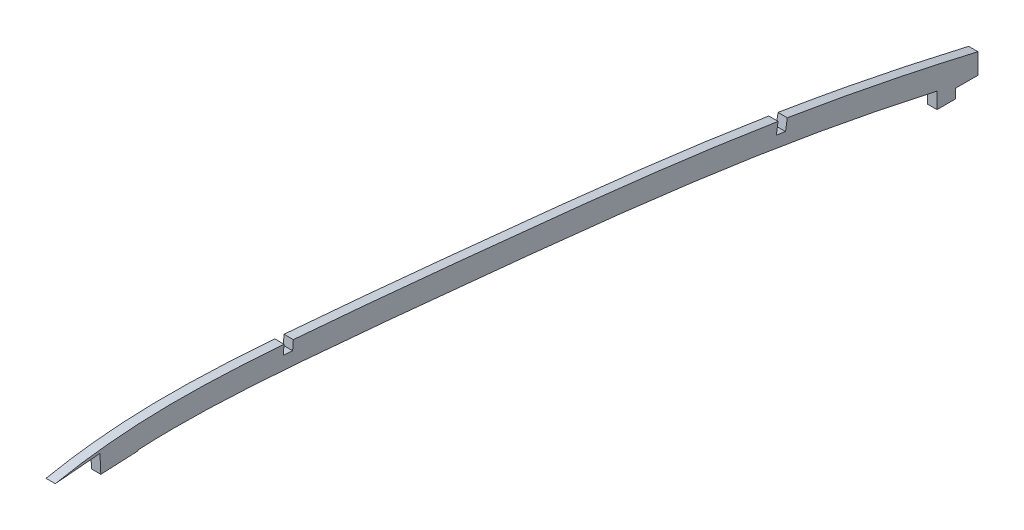
ISO-10303-21;
HEADER;
FILE_DESCRIPTION(('STEP AP214'),'2;1');
FILE_NAME('part.step','',(''),(''),'','','');
FILE_SCHEMA(('AUTOMOTIVE_DESIGN { 1 0 10303 214 1 1 1 1 }'));
ENDSEC;
DATA;
#1=APPLICATION_CONTEXT('core data for automotive mechanical design processes');
#2=APPLICATION_PROTOCOL_DEFINITION('international standard','automotive_design',2000,#1);
#3=PRODUCT_CONTEXT('',#1,'mechanical');
#4=PRODUCT('Part','Part','',(#3));
#5=PRODUCT_RELATED_PRODUCT_CATEGORY('part','',(#4));
#6=PRODUCT_DEFINITION_FORMATION('','',#4);
#7=PRODUCT_DEFINITION_CONTEXT('part definition',#1,'design');
#8=PRODUCT_DEFINITION('design','',#6,#7);
#9=PRODUCT_DEFINITION_SHAPE('','',#8);
#10=(LENGTH_UNIT() NAMED_UNIT(*) SI_UNIT(.MILLI.,.METRE.));
#11=(NAMED_UNIT(*) PLANE_ANGLE_UNIT() SI_UNIT($,.RADIAN.));
#12=(NAMED_UNIT(*) SI_UNIT($,.STERADIAN.) SOLID_ANGLE_UNIT());
#13=UNCERTAINTY_MEASURE_WITH_UNIT(LENGTH_MEASURE(1.E-05),#10,'distance_accuracy_value','');
#14=(GEOMETRIC_REPRESENTATION_CONTEXT(3) GLOBAL_UNCERTAINTY_ASSIGNED_CONTEXT((#13)) GLOBAL_UNIT_ASSIGNED_CONTEXT((#10,
#11,#12)) REPRESENTATION_CONTEXT('',''));
#15=CARTESIAN_POINT('',(0.,0.,0.));
#16=DIRECTION('',(0.,0.,1.));
#17=DIRECTION('',(1.,0.,0.));
#18=AXIS2_PLACEMENT_3D('',#15,#16,#17);
#19=CARTESIAN_POINT('',(371.221000000001,66.3992196076731,-334.782029636412));
#20=CARTESIAN_POINT('',(371.221000000001,67.7130873695188,-341.240992872507));
#21=CARTESIAN_POINT('',(371.221000000001,68.638657355068,-347.742324720006));
#22=CARTESIAN_POINT('',(371.221000000001,69.857875704508,-360.813939728301));
#23=CARTESIAN_POINT('',(371.221000000001,70.1521210315341,-367.384157752233));
#24=CARTESIAN_POINT('',(371.221000000001,70.2402894982842,-377.278023698949));
#25=CARTESIAN_POINT('',(371.221000000001,70.2110429804662,-380.582377006822));
#26=CARTESIAN_POINT('',(371.221000000001,70.0604734169837,-387.201130434233));
#27=CARTESIAN_POINT('',(371.221000000001,69.939172680445,-390.515432634477));
#28=CARTESIAN_POINT('',(371.221000000001,69.4753379407394,-400.442556531051));
#29=CARTESIAN_POINT('',(371.221000000001,69.0383787429707,-407.050981703645));
#30=CARTESIAN_POINT('',(371.221000000001,68.0465549041684,-420.258917861356));
#31=CARTESIAN_POINT('',(371.221000000001,67.4914805811708,-426.858412993564));
#32=CARTESIAN_POINT('',(371.221000000001,66.3221007450081,-440.052925110754));
#33=CARTESIAN_POINT('',(371.221000000001,65.707163942161,-446.647894367368));
#34=CARTESIAN_POINT('',(371.221000000001,64.4483940825608,-459.835648192444));
#35=CARTESIAN_POINT('',(371.221000000001,63.8043306569503,-466.42722381382));
#36=CARTESIAN_POINT('',(371.221000000001,62.5001926301305,-479.607322044501));
#37=CARTESIAN_POINT('',(371.221000000001,61.8391867078308,-486.195809266957));
#38=CARTESIAN_POINT('',(371.221000000001,60.4919854815423,-499.368381393737));
#39=CARTESIAN_POINT('',(371.221000000001,59.8055221678696,-505.95241945833));
#40=CARTESIAN_POINT('',(371.221000000001,58.385795780912,-519.112316449464));
#41=CARTESIAN_POINT('',(371.221000000001,57.6520620801529,-525.688093125005));
#42=CARTESIAN_POINT('',(371.221000000001,56.1076346026462,-538.826196255592));
#43=CARTESIAN_POINT('',(371.221000000001,55.29670062646,-545.388480731269));
#44=CARTESIAN_POINT('',(371.221000000001,53.5677545038648,-558.494335758797));
#45=CARTESIAN_POINT('',(371.221000000001,51.7308224918907,-571.581318221507));
#46=CARTESIAN_POINT('',(371.221000000001,49.6387238173349,-584.623705511581));
#47=CARTESIAN_POINT('',(371.221000000001,47.4079893906498,-597.641863596959));
#48=CARTESIAN_POINT('',(371.221000000001,46.2238100127396,-604.138916419892));
#49=CARTESIAN_POINT('',(371.221000000001,42.4657509816597,-623.594156247111));
#50=CARTESIAN_POINT('',(371.221000000001,39.6851777861279,-636.516219668044));
#51=CARTESIAN_POINT('',(371.221000000001,36.665469862715,-649.396489798407));
#52=B_SPLINE_CURVE_WITH_KNOTS('',3,(#19,#20,#21,#22,#23,#24,#25,#26,#27,#28,#29,#30,#31,#32,#33,
#34,#35,#36,#37,#38,#39,#40,#41,#42,#43,#44,#45,#46,#47,#48,#49,#50,#51),.UNSPECIFIED.,.F.,.F.,
(4,2,2,2,2,2,2,2,2,2,2,2,2,1,2,2,4),(0.,0.0624999999999997,0.124999999999999,0.156249999999999,
0.187499999999999,0.249999999999999,0.3125,0.375,0.4375,0.5,0.5625,0.625,0.6875,0.75,
0.812500000000001,0.875000000000001,1.),.UNSPECIFIED.);
#53=DIRECTION('',(1.,0.,0.));
#54=VECTOR('',#53,1.);
#55=SURFACE_OF_LINEAR_EXTRUSION('',#52,#54);
#56=CARTESIAN_POINT('',(371.221000000001,50.1646603410814,-581.238436134146));
#57=CARTESIAN_POINT('',(371.221000000001,50.6814473705831,-578.018476319009));
#58=CARTESIAN_POINT('',(371.221000000001,52.1957722178972,-568.26884455856));
#59=CARTESIAN_POINT('',(371.221000000001,53.5677545038648,-558.494335758797));
#60=CARTESIAN_POINT('',(371.221000000001,55.29670062646,-545.388480731269));
#61=CARTESIAN_POINT('',(371.221000000001,56.1076346026462,-538.826196255592));
#62=CARTESIAN_POINT('',(371.221000000001,57.6520620801529,-525.688093125005));
#63=CARTESIAN_POINT('',(371.221000000001,58.385795780912,-519.112316449464));
#64=CARTESIAN_POINT('',(371.221000000001,59.8055221678696,-505.95241945833));
#65=CARTESIAN_POINT('',(371.221000000001,60.4919854815423,-499.368381393737));
#66=CARTESIAN_POINT('',(371.221000000001,61.8391867078308,-486.195809266957));
#67=CARTESIAN_POINT('',(371.221000000001,62.5001926301305,-479.607322044501));
#68=CARTESIAN_POINT('',(371.221000000001,63.8043306569503,-466.42722381382));
#69=CARTESIAN_POINT('',(371.221000000001,64.4483940825608,-459.835648192444));
#70=CARTESIAN_POINT('',(371.221000000001,65.707163942161,-446.647894367368));
#71=CARTESIAN_POINT('',(371.221000000001,66.3221007450081,-440.052925110754));
#72=CARTESIAN_POINT('',(371.221000000001,67.4241314218812,-427.618336562321));
#73=CARTESIAN_POINT('',(371.221000000001,67.9182863508203,-421.77925111835));
#74=CARTESIAN_POINT('',(371.221000000001,68.3687879946836,-415.936865287591));
#75=B_SPLINE_CURVE_WITH_KNOTS('',3,(#56,#57,#58,#59,#60,#61,#62,#63,#64,#65,#66,#67,#68,#69,#70,
#71,#72,#73,#74),.UNSPECIFIED.,.F.,.F.,(4,1,2,2,2,2,2,2,2,4),(0.257199238990495,
0.288060226021066,0.350560226021066,0.413060226021066,0.475560226021066,0.538060226021066,
0.600560226021066,0.663060226021066,0.725560226021067,0.780860987030571),.UNSPECIFIED.);
#76=CARTESIAN_POINT('',(371.221000000001,68.3687401782054,-415.936861600501));
#77=VERTEX_POINT('',#76);
#78=CARTESIAN_POINT('',(371.221000000001,50.1646483873828,-581.238434215641));
#79=VERTEX_POINT('',#78);
#80=EDGE_CURVE('E273',#77,#79,#75,.F.);
#81=ORIENTED_EDGE('',*,*,#80,.F.);
#82=DIRECTION('',(1.,0.,0.));
#83=VECTOR('',#82,1.);
#84=CARTESIAN_POINT('',(371.221000000001,68.3687880152294,-415.93686502114));
#85=LINE('',#84,#83);
#86=CARTESIAN_POINT('',(374.396000000001,68.3687394637891,-415.936861415173));
#87=VERTEX_POINT('',#86);
#88=EDGE_CURVE('E201',#77,#87,#85,.T.);
#89=ORIENTED_EDGE('',*,*,#88,.T.);
#90=CARTESIAN_POINT('',(374.396000000001,68.3687879941045,-415.936865295101));
#91=CARTESIAN_POINT('',(374.396000000001,67.9182863503968,-421.779251123354));
#92=CARTESIAN_POINT('',(374.396000000001,67.4241314216595,-427.618336564822));
#93=CARTESIAN_POINT('',(374.396000000001,66.3221007450081,-440.052925110754));
#94=CARTESIAN_POINT('',(374.396000000001,65.707163942161,-446.647894367368));
#95=CARTESIAN_POINT('',(374.396000000001,64.4483940825608,-459.835648192444));
#96=CARTESIAN_POINT('',(374.396000000001,63.8043306569503,-466.42722381382));
#97=CARTESIAN_POINT('',(374.396000000001,62.5001926301305,-479.607322044501));
#98=CARTESIAN_POINT('',(374.396000000001,61.8391867078308,-486.195809266957));
#99=CARTESIAN_POINT('',(374.396000000001,60.4919854815423,-499.368381393737));
#100=CARTESIAN_POINT('',(374.396000000001,59.8055221678696,-505.95241945833));
#101=CARTESIAN_POINT('',(374.396000000001,58.385795780912,-519.112316449464));
#102=CARTESIAN_POINT('',(374.396000000001,57.6520620801529,-525.688093125005));
#103=CARTESIAN_POINT('',(374.396000000001,56.1076346026462,-538.826196255592));
#104=CARTESIAN_POINT('',(374.396000000001,55.29670062646,-545.388480731269));
#105=CARTESIAN_POINT('',(374.396000000001,53.5677545038648,-558.494335758797));
#106=CARTESIAN_POINT('',(374.396000000001,52.1957722178971,-568.26884455856));
#107=CARTESIAN_POINT('',(374.396000000001,50.6814473705829,-578.01847631901));
#108=CARTESIAN_POINT('',(374.396000000001,50.1646603410811,-581.238436134149));
#109=B_SPLINE_CURVE_WITH_KNOTS('',3,(#90,#91,#92,#93,#94,#95,#96,#97,#98,#99,#100,#101,#102,
#103,#104,#105,#106,#107,#108),.UNSPECIFIED.,.F.,.F.,(4,2,2,2,2,2,2,2,1,4),(0.257199239014191,
0.3125,0.375,0.4375,0.5,0.5625,0.625,0.6875,0.75,0.780860987030577),.UNSPECIFIED.);
#110=CARTESIAN_POINT('',(374.396000000001,50.1646543439586,-581.238435171642));
#111=VERTEX_POINT('',#110);
#112=EDGE_CURVE('E333',#87,#111,#109,.T.);
#113=ORIENTED_EDGE('',*,*,#112,.T.);
#114=DIRECTION('',(1.,0.,0.));
#115=VECTOR('',#114,1.);
#116=CARTESIAN_POINT('',(371.221000000001,50.1646603410811,-581.238436134148));
#117=LINE('',#116,#115);
#118=EDGE_CURVE('E53',#111,#79,#117,.F.);
#119=ORIENTED_EDGE('',*,*,#118,.T.);
#120=EDGE_LOOP('',(#81,#89,#113,#119));
#121=FACE_BOUND('',#120,.T.);
#122=ADVANCED_FACE('F33',(#121),#55,.F.);
#123=CARTESIAN_POINT('',(371.221000000001,36.665469862715,-649.396489798407));
#124=CARTESIAN_POINT('',(371.221000000001,39.6851777861279,-636.516219668044));
#125=CARTESIAN_POINT('',(371.221000000001,42.4657509816597,-623.594156247111));
#126=CARTESIAN_POINT('',(371.221000000001,46.2238100127396,-604.138916419892));
#127=CARTESIAN_POINT('',(371.221000000001,47.4079893906498,-597.641863596959));
#128=CARTESIAN_POINT('',(371.221000000001,48.9092485449679,-588.880789771118));
#129=CARTESIAN_POINT('',(371.221000000001,49.2868431071573,-586.627344864992));
#130=CARTESIAN_POINT('',(371.221000000001,49.656369151102,-584.372489833577));
#131=B_SPLINE_CURVE_WITH_KNOTS('',3,(#123,#124,#125,#126,#127,#128,#129,#130),.UNSPECIFIED.,.F.,
.F.,(4,2,2,4),(0.790876407319079,0.915876407319079,0.978376407319079,1.),.UNSPECIFIED.);
#132=CARTESIAN_POINT('',(371.221000000001,49.6563584910032,-584.372488086591));
#133=VERTEX_POINT('',#132);
#134=CARTESIAN_POINT('',(371.221000000001,36.665469862715,-649.396489798407));
#135=VERTEX_POINT('',#134);
#136=EDGE_CURVE('E281',#133,#135,#131,.F.);
#137=ORIENTED_EDGE('',*,*,#136,.F.);
#138=DIRECTION('',(1.,0.,0.));
#139=VECTOR('',#138,1.);
#140=CARTESIAN_POINT('',(371.221000000001,49.6563691568656,-584.372489798407));
#141=LINE('',#140,#139);
#142=CARTESIAN_POINT('',(374.396000000001,49.6563600705722,-584.372488340103));
#143=VERTEX_POINT('',#142);
#144=EDGE_CURVE('E427',#133,#143,#141,.T.);
#145=ORIENTED_EDGE('',*,*,#144,.T.);
#146=CARTESIAN_POINT('',(374.396000000001,49.6563691519565,-584.372489828362));
#147=CARTESIAN_POINT('',(374.396000000001,49.2868431077394,-586.627344861518));
#148=CARTESIAN_POINT('',(374.396000000001,48.9092485452654,-588.880789769382));
#149=CARTESIAN_POINT('',(374.396000000001,47.4079893906498,-597.641863596959));
#150=CARTESIAN_POINT('',(374.396000000001,46.2238100127396,-604.138916419892));
#151=CARTESIAN_POINT('',(374.396000000001,42.4657509816597,-623.594156247111));
#152=CARTESIAN_POINT('',(374.396000000001,39.6851777861279,-636.516219668044));
#153=CARTESIAN_POINT('',(374.396000000001,36.665469862715,-649.396489798407));
#154=B_SPLINE_CURVE_WITH_KNOTS('',3,(#146,#147,#148,#149,#150,#151,#152,#153),.UNSPECIFIED.,.F.,
.F.,(4,2,2,4),(0.79087640730241,0.812500000000001,0.875000000000001,1.),.UNSPECIFIED.);
#155=CARTESIAN_POINT('',(374.396000000001,36.665469862715,-649.396489798407));
#156=VERTEX_POINT('',#155);
#157=EDGE_CURVE('E206',#143,#156,#154,.T.);
#158=ORIENTED_EDGE('',*,*,#157,.T.);
#159=DIRECTION('',(1.,0.,0.));
#160=VECTOR('',#159,1.);
#161=CARTESIAN_POINT('',(371.221000000001,36.665469862715,-649.396489798407));
#162=LINE('',#161,#160);
#163=EDGE_CURVE('E310',#135,#156,#162,.T.);
#164=ORIENTED_EDGE('',*,*,#163,.F.);
#165=EDGE_LOOP('',(#137,#145,#158,#164));
#166=FACE_BOUND('',#165,.T.);
#167=ADVANCED_FACE('F263',(#166),#55,.F.);
#168=CARTESIAN_POINT('',(374.396000000001,66.3992196076731,-334.782029636412));
#169=CARTESIAN_POINT('',(374.396000000001,67.7130873695188,-341.240992872507));
#170=CARTESIAN_POINT('',(374.396000000001,68.638657355068,-347.742324720006));
#171=CARTESIAN_POINT('',(374.396000000001,69.857875704508,-360.813939728301));
#172=CARTESIAN_POINT('',(374.396000000001,70.1521210315341,-367.384157752233));
#173=CARTESIAN_POINT('',(374.396000000001,70.2402894982842,-377.278023698949));
#174=CARTESIAN_POINT('',(374.396000000001,70.2110429804662,-380.582377006822));
#175=CARTESIAN_POINT('',(374.396000000001,70.0604734169837,-387.201130434233));
#176=CARTESIAN_POINT('',(374.396000000001,69.939172680445,-390.515432634477));
#177=CARTESIAN_POINT('',(374.396000000001,69.4891353601354,-400.147260210891));
#178=CARTESIAN_POINT('',(374.396000000001,69.0771183373071,-406.461231657506));
#179=CARTESIAN_POINT('',(374.396000000001,68.608490806381,-412.770923092372));
#180=B_SPLINE_CURVE_WITH_KNOTS('',3,(#168,#169,#170,#171,#172,#173,#174,#175,#176,#177,#178,
#179),.UNSPECIFIED.,.F.,.F.,(4,2,2,2,2,4),(0.,0.0624999999999997,0.124999999999999,
0.156249999999999,0.187499999999999,0.247211273848963),.UNSPECIFIED.);
#181=CARTESIAN_POINT('',(374.396000000001,66.3992196076731,-334.782029636412));
#182=VERTEX_POINT('',#181);
#183=CARTESIAN_POINT('',(374.396000000001,68.6084860600065,-412.770922739949));
#184=VERTEX_POINT('',#183);
#185=EDGE_CURVE('E317',#182,#184,#180,.T.);
#186=ORIENTED_EDGE('',*,*,#185,.T.);
#187=DIRECTION('',(1.,0.,0.));
#188=VECTOR('',#187,1.);
#189=CARTESIAN_POINT('',(371.221000000001,68.6084908063759,-412.770923092441));
#190=LINE('',#189,#188);
#191=CARTESIAN_POINT('',(371.221000000001,68.608480645888,-412.770922337811));
#192=VERTEX_POINT('',#191);
#193=EDGE_CURVE('E61',#184,#192,#190,.F.);
#194=ORIENTED_EDGE('',*,*,#193,.T.);
#195=CARTESIAN_POINT('',(371.221000000001,68.6084908063682,-412.770923092545));
#196=CARTESIAN_POINT('',(371.221000000001,69.0771183372996,-406.461231657621));
#197=CARTESIAN_POINT('',(371.221000000001,69.4891353601327,-400.147260210949));
#198=CARTESIAN_POINT('',(371.221000000001,69.939172680445,-390.515432634477));
#199=CARTESIAN_POINT('',(371.221000000001,70.0604734169837,-387.201130434233));
#200=CARTESIAN_POINT('',(371.221000000001,70.2110429804662,-380.582377006822));
#201=CARTESIAN_POINT('',(371.221000000001,70.2402894982842,-377.278023698949));
#202=CARTESIAN_POINT('',(371.221000000001,70.1521210315341,-367.384157752233));
#203=CARTESIAN_POINT('',(371.221000000001,69.857875704508,-360.813939728301));
#204=CARTESIAN_POINT('',(371.221000000001,68.638657355068,-347.742324720006));
#205=CARTESIAN_POINT('',(371.221000000001,67.7130873695188,-341.240992872507));
#206=CARTESIAN_POINT('',(371.221000000001,66.3992196076731,-334.782029636412));
#207=B_SPLINE_CURVE_WITH_KNOTS('',3,(#195,#196,#197,#198,#199,#200,#201,#202,#203,#204,#205,
#206),.UNSPECIFIED.,.F.,.F.,(4,2,2,2,2,4),(0.,0.0597112738495071,0.0909612738495071,
0.122211273849507,0.184711273849507,0.247211273849506),.UNSPECIFIED.);
#208=CARTESIAN_POINT('',(371.221000000001,66.3992196076731,-334.782029636412));
#209=VERTEX_POINT('',#208);
#210=EDGE_CURVE('E280',#209,#192,#207,.F.);
#211=ORIENTED_EDGE('',*,*,#210,.F.);
#212=DIRECTION('',(1.,0.,0.));
#213=VECTOR('',#212,1.);
#214=CARTESIAN_POINT('',(371.221000000001,66.3992196076731,-334.782029636412));
#215=LINE('',#214,#213);
#216=EDGE_CURVE('E298',#209,#182,#215,.T.);
#217=ORIENTED_EDGE('',*,*,#216,.T.);
#218=EDGE_LOOP('',(#186,#194,#211,#217));
#219=FACE_BOUND('',#218,.T.);
#220=ADVANCED_FACE('F35',(#219),#55,.F.);
#221=CARTESIAN_POINT('',(371.221000000001,29.7064885418863,-649.396489798407));
#222=DIRECTION('',(0.,0.,1.));
#223=DIRECTION('',(0.,-1.,0.));
#224=AXIS2_PLACEMENT_3D('',#221,#222,#223);
#225=PLANE('',#224);
#226=DIRECTION('',(0.,-1.,0.));
#227=VECTOR('',#226,1.);
#228=CARTESIAN_POINT('',(374.396000000001,29.7064885418863,-649.396489798407));
#229=LINE('',#228,#227);
#230=CARTESIAN_POINT('',(374.396000000001,29.7064885418863,-649.396489798407));
#231=VERTEX_POINT('',#230);
#232=EDGE_CURVE('E474',#156,#231,#229,.T.);
#233=ORIENTED_EDGE('',*,*,#232,.T.);
#234=DIRECTION('',(1.,0.,0.));
#235=VECTOR('',#234,1.);
#236=CARTESIAN_POINT('',(371.221000000001,29.7064885418863,-649.396489798407));
#237=LINE('',#236,#235);
#238=CARTESIAN_POINT('',(371.221000000001,29.7064885418863,-649.396489798407));
#239=VERTEX_POINT('',#238);
#240=EDGE_CURVE('E313',#239,#231,#237,.T.);
#241=ORIENTED_EDGE('',*,*,#240,.F.);
#242=DIRECTION('',(0.,-1.,0.));
#243=VECTOR('',#242,1.);
#244=CARTESIAN_POINT('',(371.221000000001,29.7064885418863,-649.396489798407));
#245=LINE('',#244,#243);
#246=EDGE_CURVE('E218',#135,#239,#245,.T.);
#247=ORIENTED_EDGE('',*,*,#246,.F.);
#248=ORIENTED_EDGE('',*,*,#163,.T.);
#249=EDGE_LOOP('',(#233,#241,#247,#248));
#250=FACE_BOUND('',#249,.T.);
#251=ADVANCED_FACE('F256',(#250),#225,.F.);
#252=CARTESIAN_POINT('',(371.221000000001,29.7064889490564,-641.776489798407));
#253=DIRECTION('',(0.,0.999999999999999,-5.34343949227785E-08));
#254=DIRECTION('',(0.,5.34343949227785E-08,0.999999999999999));
#255=AXIS2_PLACEMENT_3D('',#252,#253,#254);
#256=PLANE('',#255);
#257=DIRECTION('',(0.,5.34343949227785E-08,0.999999999999999));
#258=VECTOR('',#257,1.);
#259=CARTESIAN_POINT('',(374.396000000001,29.7064889490564,-641.776489798407));
#260=LINE('',#259,#258);
#261=CARTESIAN_POINT('',(374.396000000001,29.7064889490564,-641.776489798407));
#262=VERTEX_POINT('',#261);
#263=EDGE_CURVE('E496',#231,#262,#260,.T.);
#264=ORIENTED_EDGE('',*,*,#263,.T.);
#265=DIRECTION('',(1.,0.,0.));
#266=VECTOR('',#265,1.);
#267=CARTESIAN_POINT('',(371.221000000001,29.7064889490564,-641.776489798407));
#268=LINE('',#267,#266);
#269=CARTESIAN_POINT('',(371.221000000001,29.7064889490564,-641.776489798407));
#270=VERTEX_POINT('',#269);
#271=EDGE_CURVE('E408',#270,#262,#268,.T.);
#272=ORIENTED_EDGE('',*,*,#271,.F.);
#273=DIRECTION('',(0.,5.34343949227785E-08,0.999999999999999));
#274=VECTOR('',#273,1.);
#275=CARTESIAN_POINT('',(371.221000000001,29.7064889490564,-641.776489798407));
#276=LINE('',#275,#274);
#277=EDGE_CURVE('E212',#239,#270,#276,.T.);
#278=ORIENTED_EDGE('',*,*,#277,.F.);
#279=ORIENTED_EDGE('',*,*,#240,.T.);
#280=EDGE_LOOP('',(#264,#272,#278,#279));
#281=FACE_BOUND('',#280,.T.);
#282=ADVANCED_FACE('F253',(#281),#256,.F.);
#283=CARTESIAN_POINT('',(371.221000000001,29.7064889490564,-641.776489798407));
#284=DIRECTION('',(0.,0.,1.));
#285=DIRECTION('',(1.,0.,0.));
#286=AXIS2_PLACEMENT_3D('',#283,#284,#285);
#287=PLANE('',#286);
#288=DIRECTION('',(0.,-1.,0.));
#289=VECTOR('',#288,1.);
#290=CARTESIAN_POINT('',(374.396000000001,29.7064889490564,-641.776489798407));
#291=LINE('',#290,#289);
#292=CARTESIAN_POINT('',(374.396000000001,26.5314889490564,-641.776489798407));
#293=VERTEX_POINT('',#292);
#294=EDGE_CURVE('E482',#262,#293,#291,.T.);
#295=ORIENTED_EDGE('',*,*,#294,.T.);
#296=DIRECTION('',(1.,0.,0.));
#297=VECTOR('',#296,1.);
#298=CARTESIAN_POINT('',(371.221000000001,26.5314889490564,-641.776489798407));
#299=LINE('',#298,#297);
#300=CARTESIAN_POINT('',(371.221000000001,26.5314889490564,-641.776489798407));
#301=VERTEX_POINT('',#300);
#302=EDGE_CURVE('E405',#301,#293,#299,.T.);
#303=ORIENTED_EDGE('',*,*,#302,.F.);
#304=DIRECTION('',(0.,-1.,0.));
#305=VECTOR('',#304,1.);
#306=CARTESIAN_POINT('',(371.221000000001,29.7064889490564,-641.776489798407));
#307=LINE('',#306,#305);
#308=EDGE_CURVE('E217',#270,#301,#307,.T.);
#309=ORIENTED_EDGE('',*,*,#308,.F.);
#310=ORIENTED_EDGE('',*,*,#271,.T.);
#311=EDGE_LOOP('',(#295,#303,#309,#310));
#312=FACE_BOUND('',#311,.T.);
#313=ADVANCED_FACE('F249',(#312),#287,.F.);
#314=CARTESIAN_POINT('',(371.221000000001,26.5314889490564,-641.776489798407));
#315=DIRECTION('',(0.,1.,0.));
#316=DIRECTION('',(0.,0.,1.));
#317=AXIS2_PLACEMENT_3D('',#314,#315,#316);
#318=PLANE('',#317);
#319=DIRECTION('',(0.,0.,1.));
#320=VECTOR('',#319,1.);
#321=CARTESIAN_POINT('',(374.396000000001,26.5314889490564,-641.776489798407));
#322=LINE('',#321,#320);
#323=CARTESIAN_POINT('',(374.396000000001,26.5314889490564,-635.426489798407));
#324=VERTEX_POINT('',#323);
#325=EDGE_CURVE('E485',#293,#324,#322,.T.);
#326=ORIENTED_EDGE('',*,*,#325,.T.);
#327=DIRECTION('',(1.,0.,0.));
#328=VECTOR('',#327,1.);
#329=CARTESIAN_POINT('',(371.221000000001,26.5314889490564,-635.426489798407));
#330=LINE('',#329,#328);
#331=CARTESIAN_POINT('',(371.221000000001,26.5314889490564,-635.426489798407));
#332=VERTEX_POINT('',#331);
#333=EDGE_CURVE('E402',#332,#324,#330,.T.);
#334=ORIENTED_EDGE('',*,*,#333,.F.);
#335=DIRECTION('',(0.,0.,1.));
#336=VECTOR('',#335,1.);
#337=CARTESIAN_POINT('',(371.221000000001,26.5314889490564,-641.776489798407));
#338=LINE('',#337,#336);
#339=EDGE_CURVE('E220',#301,#332,#338,.T.);
#340=ORIENTED_EDGE('',*,*,#339,.F.);
#341=ORIENTED_EDGE('',*,*,#302,.T.);
#342=EDGE_LOOP('',(#326,#334,#340,#341));
#343=FACE_BOUND('',#342,.T.);
#344=ADVANCED_FACE('F245',(#343),#318,.F.);
#345=CARTESIAN_POINT('',(371.221000000001,26.5314889490564,-635.426489798407));
#346=DIRECTION('',(0.,4.4359293191835E-13,-1.));
#347=DIRECTION('',(0.,1.,4.4359293191835E-13));
#348=AXIS2_PLACEMENT_3D('',#345,#346,#347);
#349=PLANE('',#348);
#350=DIRECTION('',(0.,1.,4.4359293191835E-13));
#351=VECTOR('',#350,1.);
#352=CARTESIAN_POINT('',(374.396000000001,26.5314889490564,-635.426489798407));
#353=LINE('',#352,#351);
#354=CARTESIAN_POINT('',(374.396000000001,32.0376421774512,-635.426489798405));
#355=VERTEX_POINT('',#354);
#356=EDGE_CURVE('E500',#324,#355,#353,.T.);
#357=ORIENTED_EDGE('',*,*,#356,.T.);
#358=DIRECTION('',(1.,0.,0.));
#359=VECTOR('',#358,1.);
#360=CARTESIAN_POINT('',(371.221000000001,32.0376421774512,-635.426489798405));
#361=LINE('',#360,#359);
#362=CARTESIAN_POINT('',(371.221000000001,32.0376421774512,-635.426489798405));
#363=VERTEX_POINT('',#362);
#364=EDGE_CURVE('E399',#363,#355,#361,.T.);
#365=ORIENTED_EDGE('',*,*,#364,.F.);
#366=DIRECTION('',(0.,1.,4.4359293191835E-13));
#367=VECTOR('',#366,1.);
#368=CARTESIAN_POINT('',(371.221000000001,26.5314889490564,-635.426489798407));
#369=LINE('',#368,#367);
#370=EDGE_CURVE('E222',#332,#363,#369,.T.);
#371=ORIENTED_EDGE('',*,*,#370,.F.);
#372=ORIENTED_EDGE('',*,*,#333,.T.);
#373=EDGE_LOOP('',(#357,#365,#371,#372));
#374=FACE_BOUND('',#373,.T.);
#375=ADVANCED_FACE('F240',(#374),#349,.F.);
#376=CARTESIAN_POINT('',(371.221000000001,29.2465511887877,-647.657163157849));
#377=CARTESIAN_POINT('',(371.221000000001,32.2405915847302,-634.886317517452));
#378=CARTESIAN_POINT('',(371.221000000001,37.7672170314206,-609.213099306468));
#379=CARTESIAN_POINT('',(371.221000000001,44.3897007191742,-570.497357953247));
#380=CARTESIAN_POINT('',(371.221000000001,49.463490269808,-531.419980681302));
#381=CARTESIAN_POINT('',(371.221000000001,53.6268939195985,-492.027742401827));
#382=CARTESIAN_POINT('',(371.221000000001,57.5382629763181,-452.509928359852));
#383=CARTESIAN_POINT('',(371.221000000001,60.5662956779507,-419.617452947087));
#384=CARTESIAN_POINT('',(371.221000000001,62.3036339621135,-393.439667345239));
#385=CARTESIAN_POINT('',(371.221000000001,62.8199774802091,-373.981350077034));
#386=CARTESIAN_POINT('',(371.221000000001,61.961505687984,-354.922859380197));
#387=CARTESIAN_POINT('',(371.221000000001,60.1864395261689,-342.469032662402));
#388=CARTESIAN_POINT('',(371.221000000001,58.93174494889,-336.300996107459));
#389=B_SPLINE_CURVE_WITH_KNOTS('',3,(#376,#377,#378,#379,#380,#381,#382,#383,#384,#385,#386,
#387,#388),.UNSPECIFIED.,.F.,.F.,(4,1,1,1,1,1,1,1,1,1,4),(0.,0.125,0.25,0.375,0.5,0.625,0.75,
0.8125,0.875,0.9375,1.),.UNSPECIFIED.);
#390=DIRECTION('',(1.,0.,0.));
#391=VECTOR('',#390,1.);
#392=SURFACE_OF_LINEAR_EXTRUSION('',#389,#391);
#393=CARTESIAN_POINT('',(374.396000000001,29.2465511887877,-647.657163157849));
#394=CARTESIAN_POINT('',(374.396000000001,32.2405915847302,-634.886317517452));
#395=CARTESIAN_POINT('',(374.396000000001,37.7672170314206,-609.213099306468));
#396=CARTESIAN_POINT('',(374.396000000001,44.3897007191742,-570.497357953247));
#397=CARTESIAN_POINT('',(374.396000000001,49.463490269808,-531.419980681302));
#398=CARTESIAN_POINT('',(374.396000000001,53.6268939195985,-492.027742401827));
#399=CARTESIAN_POINT('',(374.396000000001,57.5382629763181,-452.509928359852));
#400=CARTESIAN_POINT('',(374.396000000001,60.5662956779507,-419.617452947087));
#401=CARTESIAN_POINT('',(374.396000000001,62.3036339621135,-393.439667345239));
#402=CARTESIAN_POINT('',(374.396000000001,62.8199774802091,-373.981350077034));
#403=CARTESIAN_POINT('',(374.396000000001,61.961505687984,-354.922859380197));
#404=CARTESIAN_POINT('',(374.396000000001,60.1864395261689,-342.469032662402));
#405=CARTESIAN_POINT('',(374.396000000001,58.93174494889,-336.300996107459));
#406=B_SPLINE_CURVE_WITH_KNOTS('',3,(#393,#394,#395,#396,#397,#398,#399,#400,#401,#402,#403,
#404,#405),.UNSPECIFIED.,.F.,.F.,(4,1,1,1,1,1,1,1,1,1,4),(0.,0.125,0.25,0.375,0.5,0.625,0.75,
0.8125,0.875,0.9375,1.),.UNSPECIFIED.);
#407=CARTESIAN_POINT('',(374.396000000001,62.2480642985556,-362.974756295208));
#408=VERTEX_POINT('',#407);
#409=EDGE_CURVE('E492',#355,#408,#406,.T.);
#410=ORIENTED_EDGE('',*,*,#409,.T.);
#411=DIRECTION('',(1.,0.,0.));
#412=VECTOR('',#411,1.);
#413=CARTESIAN_POINT('',(371.221000000001,62.2480642985556,-362.974756295208));
#414=LINE('',#413,#412);
#415=CARTESIAN_POINT('',(371.221000000001,62.2480642985556,-362.974756295208));
#416=VERTEX_POINT('',#415);
#417=EDGE_CURVE('E396',#416,#408,#414,.T.);
#418=ORIENTED_EDGE('',*,*,#417,.F.);
#419=EDGE_CURVE('E224',#363,#416,#389,.T.);
#420=ORIENTED_EDGE('',*,*,#419,.F.);
#421=ORIENTED_EDGE('',*,*,#364,.T.);
#422=EDGE_LOOP('',(#410,#418,#420,#421));
#423=FACE_BOUND('',#422,.T.);
#424=ADVANCED_FACE('F235',(#423),#392,.F.);
#425=CARTESIAN_POINT('',(371.221000000001,61.9862212154004,-362.986941179701));
#426=DIRECTION('',(0.,-0.0464847590306807,0.998918999307681));
#427=DIRECTION('',(0.,-0.998918999307681,-0.0464847590306807));
#428=AXIS2_PLACEMENT_3D('',#425,#426,#427);
#429=PLANE('',#428);
#430=DIRECTION('',(0.,-0.998918999307681,-0.0464847590306807));
#431=VECTOR('',#430,1.);
#432=CARTESIAN_POINT('',(374.396000000001,61.9862212154004,-362.986941179701));
#433=LINE('',#432,#431);
#434=CARTESIAN_POINT('',(374.396000000001,61.9862212154004,-362.986941179701));
#435=VERTEX_POINT('',#434);
#436=EDGE_CURVE('E385',#408,#435,#433,.T.);
#437=ORIENTED_EDGE('',*,*,#436,.T.);
#438=DIRECTION('',(1.,0.,0.));
#439=VECTOR('',#438,1.);
#440=CARTESIAN_POINT('',(371.221000000001,61.9862212154004,-362.986941179701));
#441=LINE('',#440,#439);
#442=CARTESIAN_POINT('',(371.221000000001,61.9862212154004,-362.986941179701));
#443=VERTEX_POINT('',#442);
#444=EDGE_CURVE('E381',#443,#435,#441,.T.);
#445=ORIENTED_EDGE('',*,*,#444,.F.);
#446=DIRECTION('',(0.,-0.998918999307681,-0.0464847590306807));
#447=VECTOR('',#446,1.);
#448=CARTESIAN_POINT('',(371.221000000001,61.9862212154004,-362.986941179701));
#449=LINE('',#448,#447);
#450=EDGE_CURVE('E229',#416,#443,#449,.T.);
#451=ORIENTED_EDGE('',*,*,#450,.F.);
#452=ORIENTED_EDGE('',*,*,#417,.T.);
#453=EDGE_LOOP('',(#437,#445,#451,#452));
#454=FACE_BOUND('',#453,.T.);
#455=ADVANCED_FACE('F239',(#454),#429,.F.);
#456=CARTESIAN_POINT('',(371.221000000001,61.3958645640779,-350.300669898342));
#457=DIRECTION('',(0.,0.998918998532221,0.0464847756946805));
#458=DIRECTION('',(0.,-0.0464847756946805,0.998918998532221));
#459=AXIS2_PLACEMENT_3D('',#456,#457,#458);
#460=PLANE('',#459);
#461=DIRECTION('',(0.,-0.0464847756946804,0.998918998532221));
#462=VECTOR('',#461,1.);
#463=CARTESIAN_POINT('',(374.396000000001,61.3958645640779,-350.300669898342));
#464=LINE('',#463,#462);
#465=CARTESIAN_POINT('',(374.396000000001,61.3958645640779,-350.300669898342));
#466=VERTEX_POINT('',#465);
#467=EDGE_CURVE('E375',#435,#466,#464,.T.);
#468=ORIENTED_EDGE('',*,*,#467,.T.);
#469=DIRECTION('',(1.,0.,0.));
#470=VECTOR('',#469,1.);
#471=CARTESIAN_POINT('',(371.221000000001,61.3958645640779,-350.300669898342));
#472=LINE('',#471,#470);
#473=CARTESIAN_POINT('',(371.221000000001,61.3958645640779,-350.300669898342));
#474=VERTEX_POINT('',#473);
#475=EDGE_CURVE('E378',#474,#466,#472,.T.);
#476=ORIENTED_EDGE('',*,*,#475,.F.);
#477=DIRECTION('',(0.,-0.0464847756946804,0.998918998532221));
#478=VECTOR('',#477,1.);
#479=CARTESIAN_POINT('',(371.221000000001,61.3958645640779,-350.300669898342));
#480=LINE('',#479,#478);
#481=EDGE_CURVE('E493',#443,#474,#480,.T.);
#482=ORIENTED_EDGE('',*,*,#481,.F.);
#483=ORIENTED_EDGE('',*,*,#444,.T.);
#484=EDGE_LOOP('',(#468,#476,#482,#483));
#485=FACE_BOUND('',#484,.T.);
#486=ADVANCED_FACE('F364',(#485),#460,.F.);
#487=CARTESIAN_POINT('',(371.221000000001,67.7376355024269,-350.005555185235));
#488=DIRECTION('',(0.,0.0464847590307341,-0.998918999307679));
#489=DIRECTION('',(0.,0.998918999307679,0.0464847590307341));
#490=AXIS2_PLACEMENT_3D('',#487,#488,#489);
#491=PLANE('',#490);
#492=DIRECTION('',(0.,0.998918999307679,0.0464847590307341));
#493=VECTOR('',#492,1.);
#494=CARTESIAN_POINT('',(374.396000000001,67.7376355024269,-350.005555185235));
#495=LINE('',#494,#493);
#496=CARTESIAN_POINT('',(374.396000000001,67.7376355024269,-350.005555185235));
#497=VERTEX_POINT('',#496);
#498=EDGE_CURVE('E384',#466,#497,#495,.T.);
#499=ORIENTED_EDGE('',*,*,#498,.T.);
#500=DIRECTION('',(1.,0.,0.));
#501=VECTOR('',#500,1.);
#502=CARTESIAN_POINT('',(371.221000000001,67.7376355024269,-350.005555185235));
#503=LINE('',#502,#501);
#504=CARTESIAN_POINT('',(371.221000000001,67.7376355024269,-350.005555185235));
#505=VERTEX_POINT('',#504);
#506=EDGE_CURVE('E304',#505,#497,#503,.T.);
#507=ORIENTED_EDGE('',*,*,#506,.F.);
#508=DIRECTION('',(0.,0.998918999307679,0.0464847590307341));
#509=VECTOR('',#508,1.);
#510=CARTESIAN_POINT('',(371.221000000001,67.7376355024269,-350.005555185235));
#511=LINE('',#510,#509);
#512=EDGE_CURVE('E299',#474,#505,#511,.T.);
#513=ORIENTED_EDGE('',*,*,#512,.F.);
#514=ORIENTED_EDGE('',*,*,#475,.T.);
#515=EDGE_LOOP('',(#499,#507,#513,#514));
#516=FACE_BOUND('',#515,.T.);
#517=ADVANCED_FACE('F361',(#516),#491,.F.);
#518=CARTESIAN_POINT('',(371.221000000001,66.3992196076731,-334.782029636412));
#519=DIRECTION('',(0.,0.996157508555007,0.0875797816249874));
#520=DIRECTION('',(0.,-0.0875797816249874,0.996157508555007));
#521=AXIS2_PLACEMENT_3D('',#518,#519,#520);
#522=PLANE('',#521);
#523=DIRECTION('',(0.,-0.0875797816249874,0.996157508555007));
#524=VECTOR('',#523,1.);
#525=CARTESIAN_POINT('',(374.396000000001,66.3992196076731,-334.782029636412));
#526=LINE('',#525,#524);
#527=EDGE_CURVE('E341',#497,#182,#526,.T.);
#528=ORIENTED_EDGE('',*,*,#527,.T.);
#529=ORIENTED_EDGE('',*,*,#216,.F.);
#530=DIRECTION('',(0.,-0.0875797816249874,0.996157508555007));
#531=VECTOR('',#530,1.);
#532=CARTESIAN_POINT('',(371.221000000001,66.3992196076731,-334.782029636412));
#533=LINE('',#532,#531);
#534=EDGE_CURVE('E289',#505,#209,#533,.T.);
#535=ORIENTED_EDGE('',*,*,#534,.F.);
#536=ORIENTED_EDGE('',*,*,#506,.T.);
#537=EDGE_LOOP('',(#528,#529,#535,#536));
#538=FACE_BOUND('',#537,.T.);
#539=ADVANCED_FACE('F358',(#538),#522,.F.);
#540=CARTESIAN_POINT('',(371.221000000001,61.1655860946865,-492.782095330347));
#541=DIRECTION('',(-1.,0.,0.));
#542=DIRECTION('',(0.,0.,1.));
#543=AXIS2_PLACEMENT_3D('',#540,#541,#542);
#544=PLANE('',#543);
#545=DIRECTION('',(0.,-0.997253262558018,0.0740670663479331));
#546=VECTOR('',#545,1.);
#547=CARTESIAN_POINT('',(371.221000000001,66.8811695227003,-415.826378004729));
#548=LINE('',#547,#546);
#549=CARTESIAN_POINT('',(371.221000000001,65.2070487620996,-415.702039265408));
#550=VERTEX_POINT('',#549);
#551=EDGE_CURVE('E199',#77,#550,#548,.T.);
#552=ORIENTED_EDGE('',*,*,#551,.F.);
#553=ORIENTED_EDGE('',*,*,#80,.T.);
#554=DIRECTION('',(0.,0.987364289805928,-0.158466902588635));
#555=VECTOR('',#554,1.);
#556=CARTESIAN_POINT('',(371.221000000001,47.0490509881663,-580.738396818437));
#557=LINE('',#556,#555);
#558=CARTESIAN_POINT('',(371.221000000001,46.40280239692,-580.634677235286));
#559=VERTEX_POINT('',#558);
#560=EDGE_CURVE('E451',#559,#79,#557,.T.);
#561=ORIENTED_EDGE('',*,*,#560,.F.);
#562=DIRECTION('',(0.,0.158466902588543,0.987364289805943));
#563=VECTOR('',#562,1.);
#564=CARTESIAN_POINT('',(371.221000000001,60.519337503432,-492.678375747194));
#565=LINE('',#564,#563);
#566=CARTESIAN_POINT('',(371.221000000001,45.8996699812014,-583.76955885542));
#567=VERTEX_POINT('',#566);
#568=EDGE_CURVE('E441',#567,#559,#565,.T.);
#569=ORIENTED_EDGE('',*,*,#568,.F.);
#570=DIRECTION('',(0.,-0.987364289805934,0.158466902588595));
#571=VECTOR('',#570,1.);
#572=CARTESIAN_POINT('',(371.221000000001,46.5459185724511,-583.873278438571));
#573=LINE('',#572,#571);
#574=EDGE_CURVE('E437',#133,#567,#573,.T.);
#575=ORIENTED_EDGE('',*,*,#574,.F.);
#576=ORIENTED_EDGE('',*,*,#136,.T.);
#577=ORIENTED_EDGE('',*,*,#246,.T.);
#578=ORIENTED_EDGE('',*,*,#277,.T.);
#579=ORIENTED_EDGE('',*,*,#308,.T.);
#580=ORIENTED_EDGE('',*,*,#339,.T.);
#581=ORIENTED_EDGE('',*,*,#370,.T.);
#582=ORIENTED_EDGE('',*,*,#419,.T.);
#583=ORIENTED_EDGE('',*,*,#450,.T.);
#584=ORIENTED_EDGE('',*,*,#481,.T.);
#585=ORIENTED_EDGE('',*,*,#512,.T.);
#586=ORIENTED_EDGE('',*,*,#534,.T.);
#587=ORIENTED_EDGE('',*,*,#210,.T.);
#588=DIRECTION('',(0.,0.997253262558022,-0.0740670663478767));
#589=VECTOR('',#588,1.);
#590=CARTESIAN_POINT('',(371.221000000001,67.1163324583505,-412.660098896107));
#591=LINE('',#590,#589);
#592=CARTESIAN_POINT('',(371.221000000001,65.4422116977542,-412.535760156787));
#593=VERTEX_POINT('',#592);
#594=EDGE_CURVE('E423',#593,#192,#591,.T.);
#595=ORIENTED_EDGE('',*,*,#594,.F.);
#596=DIRECTION('',(0.,0.0740670663478944,0.997253262558021));
#597=VECTOR('',#596,1.);
#598=CARTESIAN_POINT('',(371.221000000001,59.4914653340888,-492.657756591026));
#599=LINE('',#598,#597);
#600=EDGE_CURVE('E177',#550,#593,#599,.T.);
#601=ORIENTED_EDGE('',*,*,#600,.F.);
#602=EDGE_LOOP('',(#552,#553,#561,#569,#575,#576,#577,#578,#579,#580,#581,#582,#583,#584,#585,
#586,#587,#595,#601));
#603=FACE_BOUND('',#602,.T.);
#604=ADVANCED_FACE('F355',(#603),#544,.T.);
#605=CARTESIAN_POINT('',(374.396000000001,61.1655860946865,-492.782095330347));
#606=DIRECTION('',(-1.,0.,0.));
#607=DIRECTION('',(0.,0.,1.));
#608=AXIS2_PLACEMENT_3D('',#605,#606,#607);
#609=PLANE('',#608);
#610=ORIENTED_EDGE('',*,*,#112,.F.);
#611=DIRECTION('',(0.,0.997253262558018,-0.0740670663479331));
#612=VECTOR('',#611,1.);
#613=CARTESIAN_POINT('',(374.396000000001,69.5608104532614,-416.025397802451));
#614=LINE('',#613,#612);
#615=CARTESIAN_POINT('',(374.396000000001,65.2070487620996,-415.702039265408));
#616=VERTEX_POINT('',#615);
#617=EDGE_CURVE('E180',#616,#87,#614,.T.);
#618=ORIENTED_EDGE('',*,*,#617,.F.);
#619=DIRECTION('',(0.,-0.0740670663478944,-0.997253262558021));
#620=VECTOR('',#619,1.);
#621=CARTESIAN_POINT('',(374.396000000001,65.4422116977542,-412.535760156787));
#622=LINE('',#621,#620);
#623=CARTESIAN_POINT('',(374.396000000001,65.4422116977542,-412.535760156787));
#624=VERTEX_POINT('',#623);
#625=EDGE_CURVE('E174',#624,#616,#622,.T.);
#626=ORIENTED_EDGE('',*,*,#625,.F.);
#627=DIRECTION('',(0.,0.997253262558022,-0.0740670663478767));
#628=VECTOR('',#627,1.);
#629=CARTESIAN_POINT('',(374.396000000001,67.1163324583505,-412.660098896107));
#630=LINE('',#629,#628);
#631=EDGE_CURVE('E11',#624,#184,#630,.T.);
#632=ORIENTED_EDGE('',*,*,#631,.T.);
#633=ORIENTED_EDGE('',*,*,#185,.F.);
#634=ORIENTED_EDGE('',*,*,#527,.F.);
#635=ORIENTED_EDGE('',*,*,#498,.F.);
#636=ORIENTED_EDGE('',*,*,#467,.F.);
#637=ORIENTED_EDGE('',*,*,#436,.F.);
#638=ORIENTED_EDGE('',*,*,#409,.F.);
#639=ORIENTED_EDGE('',*,*,#356,.F.);
#640=ORIENTED_EDGE('',*,*,#325,.F.);
#641=ORIENTED_EDGE('',*,*,#294,.F.);
#642=ORIENTED_EDGE('',*,*,#263,.F.);
#643=ORIENTED_EDGE('',*,*,#232,.F.);
#644=ORIENTED_EDGE('',*,*,#157,.F.);
#645=DIRECTION('',(0.,0.987364289805934,-0.158466902588595));
#646=VECTOR('',#645,1.);
#647=CARTESIAN_POINT('',(374.396000000001,49.6563691568656,-584.372489798407));
#648=LINE('',#647,#646);
#649=CARTESIAN_POINT('',(374.396000000001,45.8996699812014,-583.76955885542));
#650=VERTEX_POINT('',#649);
#651=EDGE_CURVE('E442',#650,#143,#648,.T.);
#652=ORIENTED_EDGE('',*,*,#651,.F.);
#653=DIRECTION('',(0.,-0.158466902588543,-0.987364289805943));
#654=VECTOR('',#653,1.);
#655=CARTESIAN_POINT('',(374.396000000001,46.40280239692,-580.634677235286));
#656=LINE('',#655,#654);
#657=CARTESIAN_POINT('',(374.396000000001,46.40280239692,-580.634677235286));
#658=VERTEX_POINT('',#657);
#659=EDGE_CURVE('E445',#658,#650,#656,.T.);
#660=ORIENTED_EDGE('',*,*,#659,.F.);
#661=DIRECTION('',(0.,0.987364289805928,-0.158466902588635));
#662=VECTOR('',#661,1.);
#663=CARTESIAN_POINT('',(374.396000000001,47.0490509881663,-580.738396818437));
#664=LINE('',#663,#662);
#665=EDGE_CURVE('E45',#658,#111,#664,.T.);
#666=ORIENTED_EDGE('',*,*,#665,.T.);
#667=EDGE_LOOP('',(#610,#618,#626,#632,#633,#634,#635,#636,#637,#638,#639,#640,#641,#642,#643,
#644,#652,#660,#666));
#668=FACE_BOUND('',#667,.T.);
#669=ADVANCED_FACE('F187',(#668),#609,.F.);
#670=CARTESIAN_POINT('',(371.211000000001,49.6563691568656,-584.372489798407));
#671=DIRECTION('',(0.,-0.158466902588595,-0.987364289805934));
#672=DIRECTION('',(0.,0.987364289805934,-0.158466902588595));
#673=AXIS2_PLACEMENT_3D('',#670,#671,#672);
#674=PLANE('',#673);
#675=ORIENTED_EDGE('',*,*,#574,.T.);
#676=DIRECTION('',(1.,0.,0.));
#677=VECTOR('',#676,1.);
#678=CARTESIAN_POINT('',(371.211000000001,45.8996699812014,-583.76955885542));
#679=LINE('',#678,#677);
#680=EDGE_CURVE('E188',#567,#650,#679,.T.);
#681=ORIENTED_EDGE('',*,*,#680,.T.);
#682=ORIENTED_EDGE('',*,*,#651,.T.);
#683=ORIENTED_EDGE('',*,*,#144,.F.);
#684=EDGE_LOOP('',(#675,#681,#682,#683));
#685=FACE_BOUND('',#684,.T.);
#686=ADVANCED_FACE('F354',(#685),#674,.F.);
#687=CARTESIAN_POINT('',(371.211000000001,50.1646603410811,-581.238436134148));
#688=DIRECTION('',(0.,0.158466902588635,0.987364289805928));
#689=DIRECTION('',(0.,-0.987364289805928,0.158466902588635));
#690=AXIS2_PLACEMENT_3D('',#687,#688,#689);
#691=PLANE('',#690);
#692=ORIENTED_EDGE('',*,*,#665,.F.);
#693=DIRECTION('',(1.,0.,0.));
#694=VECTOR('',#693,1.);
#695=CARTESIAN_POINT('',(371.211000000001,46.40280239692,-580.634677235286));
#696=LINE('',#695,#694);
#697=EDGE_CURVE('E191',#559,#658,#696,.T.);
#698=ORIENTED_EDGE('',*,*,#697,.F.);
#699=ORIENTED_EDGE('',*,*,#560,.T.);
#700=ORIENTED_EDGE('',*,*,#118,.F.);
#701=EDGE_LOOP('',(#692,#698,#699,#700));
#702=FACE_BOUND('',#701,.T.);
#703=ADVANCED_FACE('F463',(#702),#691,.F.);
#704=CARTESIAN_POINT('',(371.211000000001,46.40280239692,-580.634677235286));
#705=DIRECTION('',(0.,-0.987364289805943,0.158466902588543));
#706=DIRECTION('',(0.,-0.158466902588543,-0.987364289805943));
#707=AXIS2_PLACEMENT_3D('',#704,#705,#706);
#708=PLANE('',#707);
#709=ORIENTED_EDGE('',*,*,#568,.T.);
#710=ORIENTED_EDGE('',*,*,#697,.T.);
#711=ORIENTED_EDGE('',*,*,#659,.T.);
#712=ORIENTED_EDGE('',*,*,#680,.F.);
#713=EDGE_LOOP('',(#709,#710,#711,#712));
#714=FACE_BOUND('',#713,.T.);
#715=ADVANCED_FACE('F460',(#714),#708,.F.);
#716=CARTESIAN_POINT('',(371.211000000001,69.5608104532614,-416.025397802451));
#717=DIRECTION('',(0.,-0.0740670663479331,-0.997253262558018));
#718=DIRECTION('',(0.,0.997253262558018,-0.0740670663479331));
#719=AXIS2_PLACEMENT_3D('',#716,#717,#718);
#720=PLANE('',#719);
#721=ORIENTED_EDGE('',*,*,#551,.T.);
#722=DIRECTION('',(1.,0.,0.));
#723=VECTOR('',#722,1.);
#724=CARTESIAN_POINT('',(371.211000000001,65.2070487620996,-415.702039265408));
#725=LINE('',#724,#723);
#726=EDGE_CURVE('E179',#550,#616,#725,.T.);
#727=ORIENTED_EDGE('',*,*,#726,.T.);
#728=ORIENTED_EDGE('',*,*,#617,.T.);
#729=ORIENTED_EDGE('',*,*,#88,.F.);
#730=EDGE_LOOP('',(#721,#727,#728,#729));
#731=FACE_BOUND('',#730,.T.);
#732=ADVANCED_FACE('F517',(#731),#720,.F.);
#733=CARTESIAN_POINT('',(371.211000000001,68.6084908063759,-412.770923092441));
#734=DIRECTION('',(0.,0.0740670663478767,0.997253262558022));
#735=DIRECTION('',(0.,-0.997253262558022,0.0740670663478767));
#736=AXIS2_PLACEMENT_3D('',#733,#734,#735);
#737=PLANE('',#736);
#738=ORIENTED_EDGE('',*,*,#631,.F.);
#739=DIRECTION('',(1.,0.,0.));
#740=VECTOR('',#739,1.);
#741=CARTESIAN_POINT('',(371.211000000001,65.4422116977542,-412.535760156787));
#742=LINE('',#741,#740);
#743=EDGE_CURVE('E170',#593,#624,#742,.T.);
#744=ORIENTED_EDGE('',*,*,#743,.F.);
#745=ORIENTED_EDGE('',*,*,#594,.T.);
#746=ORIENTED_EDGE('',*,*,#193,.F.);
#747=EDGE_LOOP('',(#738,#744,#745,#746));
#748=FACE_BOUND('',#747,.T.);
#749=ADVANCED_FACE('F182',(#748),#737,.F.);
#750=CARTESIAN_POINT('',(371.211000000001,65.4422116977542,-412.535760156787));
#751=DIRECTION('',(0.,-0.997253262558021,0.0740670663478944));
#752=DIRECTION('',(0.,-0.0740670663478944,-0.997253262558021));
#753=AXIS2_PLACEMENT_3D('',#750,#751,#752);
#754=PLANE('',#753);
#755=ORIENTED_EDGE('',*,*,#600,.T.);
#756=ORIENTED_EDGE('',*,*,#743,.T.);
#757=ORIENTED_EDGE('',*,*,#625,.T.);
#758=ORIENTED_EDGE('',*,*,#726,.F.);
#759=EDGE_LOOP('',(#755,#756,#757,#758));
#760=FACE_BOUND('',#759,.T.);
#761=ADVANCED_FACE('F171',(#760),#754,.F.);
#762=CLOSED_SHELL('',(#122,#167,#220,#251,#282,#313,#344,#375,#424,#455,#486,#517,#539,#604,
#669,#686,#703,#715,#732,#749,#761));
#763=MANIFOLD_SOLID_BREP('B2',#762);
#764=ADVANCED_BREP_SHAPE_REPRESENTATION('',(#18,#763),#14);
#765=SHAPE_DEFINITION_REPRESENTATION(#9,#764);
ENDSEC;
END-ISO-10303-21;
